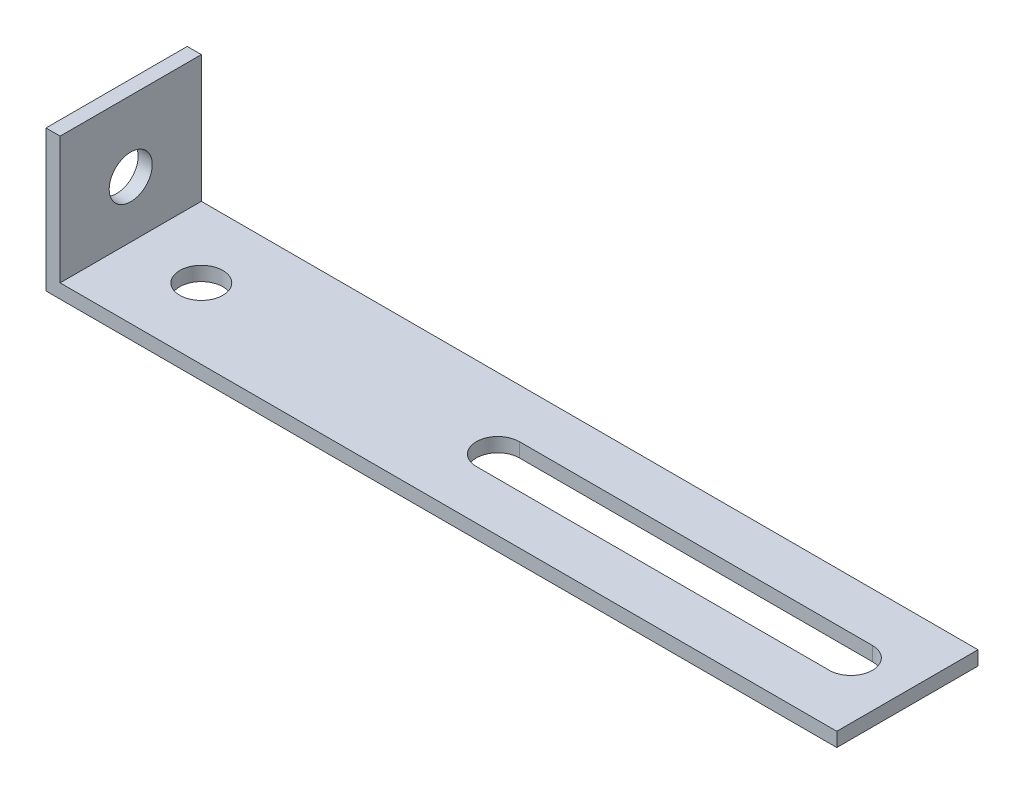
ISO-10303-21;
HEADER;
FILE_DESCRIPTION(('STEP AP214'),'2;1');
FILE_NAME('part.step','',(''),(''),'','','');
FILE_SCHEMA(('AUTOMOTIVE_DESIGN { 1 0 10303 214 1 1 1 1 }'));
ENDSEC;
DATA;
#1=APPLICATION_CONTEXT('core data for automotive mechanical design processes');
#2=APPLICATION_PROTOCOL_DEFINITION('international standard','automotive_design',2000,#1);
#3=PRODUCT_CONTEXT('',#1,'mechanical');
#4=PRODUCT('Part','Part','',(#3));
#5=PRODUCT_RELATED_PRODUCT_CATEGORY('part','',(#4));
#6=PRODUCT_DEFINITION_FORMATION('','',#4);
#7=PRODUCT_DEFINITION_CONTEXT('part definition',#1,'design');
#8=PRODUCT_DEFINITION('design','',#6,#7);
#9=PRODUCT_DEFINITION_SHAPE('','',#8);
#10=(LENGTH_UNIT() NAMED_UNIT(*) SI_UNIT(.MILLI.,.METRE.));
#11=(NAMED_UNIT(*) PLANE_ANGLE_UNIT() SI_UNIT($,.RADIAN.));
#12=(NAMED_UNIT(*) SI_UNIT($,.STERADIAN.) SOLID_ANGLE_UNIT());
#13=UNCERTAINTY_MEASURE_WITH_UNIT(LENGTH_MEASURE(1.E-05),#10,'distance_accuracy_value','');
#14=(GEOMETRIC_REPRESENTATION_CONTEXT(3) GLOBAL_UNCERTAINTY_ASSIGNED_CONTEXT((#13)) GLOBAL_UNIT_ASSIGNED_CONTEXT((#10,
#11,#12)) REPRESENTATION_CONTEXT('',''));
#15=CARTESIAN_POINT('',(0.,0.,0.));
#16=DIRECTION('',(0.,0.,1.));
#17=DIRECTION('',(1.,0.,0.));
#18=AXIS2_PLACEMENT_3D('',#15,#16,#17);
#19=CARTESIAN_POINT('',(112.,0.,20.));
#20=DIRECTION('',(0.,1.,0.));
#21=DIRECTION('',(-1.,0.,0.));
#22=AXIS2_PLACEMENT_3D('',#19,#20,#21);
#23=PLANE('',#22);
#24=DIRECTION('',(-1.,0.,0.));
#25=VECTOR('',#24,1.);
#26=CARTESIAN_POINT('',(54.,0.,6.95));
#27=LINE('',#26,#25);
#28=CARTESIAN_POINT('',(104.,0.,6.95));
#29=VERTEX_POINT('',#28);
#30=CARTESIAN_POINT('',(54.,0.,6.95));
#31=VERTEX_POINT('',#30);
#32=EDGE_CURVE('E123',#29,#31,#27,.T.);
#33=ORIENTED_EDGE('',*,*,#32,.T.);
#34=CARTESIAN_POINT('',(54.,0.,10.));
#35=DIRECTION('',(0.,1.,0.));
#36=DIRECTION('',(-1.,0.,0.));
#37=AXIS2_PLACEMENT_3D('',#34,#35,#36);
#38=CIRCLE('',#37,3.05);
#39=CARTESIAN_POINT('',(54.,0.,13.05));
#40=VERTEX_POINT('',#39);
#41=EDGE_CURVE('E117',#31,#40,#38,.T.);
#42=ORIENTED_EDGE('',*,*,#41,.T.);
#43=DIRECTION('',(1.,0.,0.));
#44=VECTOR('',#43,1.);
#45=CARTESIAN_POINT('',(54.,0.,13.05));
#46=LINE('',#45,#44);
#47=CARTESIAN_POINT('',(104.,0.,13.05));
#48=VERTEX_POINT('',#47);
#49=EDGE_CURVE('E126',#40,#48,#46,.T.);
#50=ORIENTED_EDGE('',*,*,#49,.T.);
#51=CARTESIAN_POINT('',(104.,0.,10.));
#52=DIRECTION('',(0.,1.,0.));
#53=DIRECTION('',(-1.,0.,0.));
#54=AXIS2_PLACEMENT_3D('',#51,#52,#53);
#55=CIRCLE('',#54,3.05);
#56=EDGE_CURVE('E53',#48,#29,#55,.T.);
#57=ORIENTED_EDGE('',*,*,#56,.T.);
#58=EDGE_LOOP('',(#33,#42,#50,#57));
#59=FACE_BOUND('',#58,.T.);
#60=CARTESIAN_POINT('',(12.,0.,10.));
#61=DIRECTION('',(0.,1.,0.));
#62=DIRECTION('',(-1.,0.,0.));
#63=AXIS2_PLACEMENT_3D('',#60,#61,#62);
#64=CIRCLE('',#63,3.05);
#65=CARTESIAN_POINT('',(8.95,0.,10.));
#66=VERTEX_POINT('',#65);
#67=EDGE_CURVE('E151',#66,#66,#64,.T.);
#68=ORIENTED_EDGE('',*,*,#67,.T.);
#69=EDGE_LOOP('',(#68));
#70=FACE_BOUND('',#69,.T.);
#71=DIRECTION('',(1.,0.,0.));
#72=VECTOR('',#71,1.);
#73=CARTESIAN_POINT('',(112.,0.,0.));
#74=LINE('',#73,#72);
#75=CARTESIAN_POINT('',(0.,0.,0.));
#76=VERTEX_POINT('',#75);
#77=CARTESIAN_POINT('',(112.,0.,0.));
#78=VERTEX_POINT('',#77);
#79=EDGE_CURVE('E162',#76,#78,#74,.T.);
#80=ORIENTED_EDGE('',*,*,#79,.T.);
#81=DIRECTION('',(0.,0.,-1.));
#82=VECTOR('',#81,1.);
#83=CARTESIAN_POINT('',(112.,0.,20.));
#84=LINE('',#83,#82);
#85=CARTESIAN_POINT('',(112.,0.,20.));
#86=VERTEX_POINT('',#85);
#87=EDGE_CURVE('E11',#86,#78,#84,.T.);
#88=ORIENTED_EDGE('',*,*,#87,.F.);
#89=DIRECTION('',(1.,0.,0.));
#90=VECTOR('',#89,1.);
#91=CARTESIAN_POINT('',(112.,0.,20.));
#92=LINE('',#91,#90);
#93=CARTESIAN_POINT('',(0.,0.,20.));
#94=VERTEX_POINT('',#93);
#95=EDGE_CURVE('E163',#94,#86,#92,.T.);
#96=ORIENTED_EDGE('',*,*,#95,.F.);
#97=DIRECTION('',(0.,0.,-1.));
#98=VECTOR('',#97,1.);
#99=CARTESIAN_POINT('',(0.,0.,20.));
#100=LINE('',#99,#98);
#101=EDGE_CURVE('E177',#94,#76,#100,.T.);
#102=ORIENTED_EDGE('',*,*,#101,.T.);
#103=EDGE_LOOP('',(#80,#88,#96,#102));
#104=FACE_BOUND('',#103,.T.);
#105=ADVANCED_FACE('F39',(#59,#70,#104),#23,.F.);
#106=CARTESIAN_POINT('',(112.,2.,20.));
#107=DIRECTION('',(-1.,0.,0.));
#108=DIRECTION('',(0.,0.,1.));
#109=AXIS2_PLACEMENT_3D('',#106,#107,#108);
#110=PLANE('',#109);
#111=DIRECTION('',(0.,1.,0.));
#112=VECTOR('',#111,1.);
#113=CARTESIAN_POINT('',(112.,2.,0.));
#114=LINE('',#113,#112);
#115=CARTESIAN_POINT('',(112.,2.,0.));
#116=VERTEX_POINT('',#115);
#117=EDGE_CURVE('E180',#78,#116,#114,.T.);
#118=ORIENTED_EDGE('',*,*,#117,.T.);
#119=DIRECTION('',(0.,0.,-1.));
#120=VECTOR('',#119,1.);
#121=CARTESIAN_POINT('',(112.,2.,20.));
#122=LINE('',#121,#120);
#123=CARTESIAN_POINT('',(112.,2.,20.));
#124=VERTEX_POINT('',#123);
#125=EDGE_CURVE('E46',#124,#116,#122,.T.);
#126=ORIENTED_EDGE('',*,*,#125,.F.);
#127=DIRECTION('',(0.,1.,0.));
#128=VECTOR('',#127,1.);
#129=CARTESIAN_POINT('',(112.,2.,20.));
#130=LINE('',#129,#128);
#131=EDGE_CURVE('E166',#86,#124,#130,.T.);
#132=ORIENTED_EDGE('',*,*,#131,.F.);
#133=ORIENTED_EDGE('',*,*,#87,.T.);
#134=EDGE_LOOP('',(#118,#126,#132,#133));
#135=FACE_BOUND('',#134,.T.);
#136=ADVANCED_FACE('F227',(#135),#110,.F.);
#137=CARTESIAN_POINT('',(2.,2.,20.));
#138=DIRECTION('',(0.,-1.,0.));
#139=DIRECTION('',(1.,0.,0.));
#140=AXIS2_PLACEMENT_3D('',#137,#138,#139);
#141=PLANE('',#140);
#142=DIRECTION('',(1.,0.,0.));
#143=VECTOR('',#142,1.);
#144=CARTESIAN_POINT('',(54.,2.,13.05));
#145=LINE('',#144,#143);
#146=CARTESIAN_POINT('',(54.,2.,13.05));
#147=VERTEX_POINT('',#146);
#148=CARTESIAN_POINT('',(104.,2.,13.05));
#149=VERTEX_POINT('',#148);
#150=EDGE_CURVE('E141',#147,#149,#145,.T.);
#151=ORIENTED_EDGE('',*,*,#150,.F.);
#152=CARTESIAN_POINT('',(54.,2.,10.));
#153=DIRECTION('',(0.,1.,0.));
#154=DIRECTION('',(-1.,0.,0.));
#155=AXIS2_PLACEMENT_3D('',#152,#153,#154);
#156=CIRCLE('',#155,3.05);
#157=CARTESIAN_POINT('',(54.,2.,6.95));
#158=VERTEX_POINT('',#157);
#159=EDGE_CURVE('E61',#158,#147,#156,.T.);
#160=ORIENTED_EDGE('',*,*,#159,.F.);
#161=DIRECTION('',(-1.,0.,0.));
#162=VECTOR('',#161,1.);
#163=CARTESIAN_POINT('',(54.,2.,6.95));
#164=LINE('',#163,#162);
#165=CARTESIAN_POINT('',(104.,2.,6.95));
#166=VERTEX_POINT('',#165);
#167=EDGE_CURVE('E132',#166,#158,#164,.T.);
#168=ORIENTED_EDGE('',*,*,#167,.F.);
#169=CARTESIAN_POINT('',(104.,2.,10.));
#170=DIRECTION('',(0.,1.,0.));
#171=DIRECTION('',(-1.,0.,0.));
#172=AXIS2_PLACEMENT_3D('',#169,#170,#171);
#173=CIRCLE('',#172,3.05);
#174=EDGE_CURVE('E135',#149,#166,#173,.T.);
#175=ORIENTED_EDGE('',*,*,#174,.F.);
#176=EDGE_LOOP('',(#151,#160,#168,#175));
#177=FACE_BOUND('',#176,.T.);
#178=CARTESIAN_POINT('',(12.,2.,10.));
#179=DIRECTION('',(0.,1.,0.));
#180=DIRECTION('',(-1.,0.,0.));
#181=AXIS2_PLACEMENT_3D('',#178,#179,#180);
#182=CIRCLE('',#181,3.05);
#183=CARTESIAN_POINT('',(8.95,2.,10.));
#184=VERTEX_POINT('',#183);
#185=EDGE_CURVE('E147',#184,#184,#182,.T.);
#186=ORIENTED_EDGE('',*,*,#185,.F.);
#187=EDGE_LOOP('',(#186));
#188=FACE_BOUND('',#187,.T.);
#189=DIRECTION('',(-1.,0.,0.));
#190=VECTOR('',#189,1.);
#191=CARTESIAN_POINT('',(2.,2.,0.));
#192=LINE('',#191,#190);
#193=CARTESIAN_POINT('',(2.,2.,0.));
#194=VERTEX_POINT('',#193);
#195=EDGE_CURVE('E182',#116,#194,#192,.T.);
#196=ORIENTED_EDGE('',*,*,#195,.T.);
#197=DIRECTION('',(0.,0.,-1.));
#198=VECTOR('',#197,1.);
#199=CARTESIAN_POINT('',(2.,2.,20.));
#200=LINE('',#199,#198);
#201=CARTESIAN_POINT('',(2.,2.,20.));
#202=VERTEX_POINT('',#201);
#203=EDGE_CURVE('E197',#202,#194,#200,.T.);
#204=ORIENTED_EDGE('',*,*,#203,.F.);
#205=DIRECTION('',(-1.,0.,0.));
#206=VECTOR('',#205,1.);
#207=CARTESIAN_POINT('',(2.,2.,20.));
#208=LINE('',#207,#206);
#209=EDGE_CURVE('E169',#124,#202,#208,.T.);
#210=ORIENTED_EDGE('',*,*,#209,.F.);
#211=ORIENTED_EDGE('',*,*,#125,.T.);
#212=EDGE_LOOP('',(#196,#204,#210,#211));
#213=FACE_BOUND('',#212,.T.);
#214=ADVANCED_FACE('F204',(#177,#188,#213),#141,.F.);
#215=CARTESIAN_POINT('',(2.,20.,20.));
#216=DIRECTION('',(-1.,0.,0.));
#217=DIRECTION('',(0.,-1.,0.));
#218=AXIS2_PLACEMENT_3D('',#215,#216,#217);
#219=PLANE('',#218);
#220=CARTESIAN_POINT('',(2.,10.,10.));
#221=DIRECTION('',(-1.,0.,0.));
#222=DIRECTION('',(0.,-1.,0.));
#223=AXIS2_PLACEMENT_3D('',#220,#221,#222);
#224=CIRCLE('',#223,3.05);
#225=CARTESIAN_POINT('',(2.,6.94999999999999,10.));
#226=VERTEX_POINT('',#225);
#227=EDGE_CURVE('E159',#226,#226,#224,.T.);
#228=ORIENTED_EDGE('',*,*,#227,.T.);
#229=EDGE_LOOP('',(#228));
#230=FACE_BOUND('',#229,.T.);
#231=DIRECTION('',(0.,1.,0.));
#232=VECTOR('',#231,1.);
#233=CARTESIAN_POINT('',(2.,20.,0.));
#234=LINE('',#233,#232);
#235=CARTESIAN_POINT('',(2.,20.,0.));
#236=VERTEX_POINT('',#235);
#237=EDGE_CURVE('E184',#194,#236,#234,.T.);
#238=ORIENTED_EDGE('',*,*,#237,.T.);
#239=DIRECTION('',(0.,0.,-1.));
#240=VECTOR('',#239,1.);
#241=CARTESIAN_POINT('',(2.,20.,20.));
#242=LINE('',#241,#240);
#243=CARTESIAN_POINT('',(2.,20.,20.));
#244=VERTEX_POINT('',#243);
#245=EDGE_CURVE('E194',#244,#236,#242,.T.);
#246=ORIENTED_EDGE('',*,*,#245,.F.);
#247=DIRECTION('',(0.,1.,0.));
#248=VECTOR('',#247,1.);
#249=CARTESIAN_POINT('',(2.,20.,20.));
#250=LINE('',#249,#248);
#251=EDGE_CURVE('E171',#202,#244,#250,.T.);
#252=ORIENTED_EDGE('',*,*,#251,.F.);
#253=ORIENTED_EDGE('',*,*,#203,.T.);
#254=EDGE_LOOP('',(#238,#246,#252,#253));
#255=FACE_BOUND('',#254,.T.);
#256=ADVANCED_FACE('F215',(#230,#255),#219,.F.);
#257=CARTESIAN_POINT('',(0.,20.,20.));
#258=DIRECTION('',(0.,-1.,0.));
#259=DIRECTION('',(0.,0.,-1.));
#260=AXIS2_PLACEMENT_3D('',#257,#258,#259);
#261=PLANE('',#260);
#262=DIRECTION('',(-1.,0.,0.));
#263=VECTOR('',#262,1.);
#264=CARTESIAN_POINT('',(0.,20.,0.));
#265=LINE('',#264,#263);
#266=CARTESIAN_POINT('',(0.,20.,0.));
#267=VERTEX_POINT('',#266);
#268=EDGE_CURVE('E186',#236,#267,#265,.T.);
#269=ORIENTED_EDGE('',*,*,#268,.T.);
#270=DIRECTION('',(0.,0.,-1.));
#271=VECTOR('',#270,1.);
#272=CARTESIAN_POINT('',(0.,20.,20.));
#273=LINE('',#272,#271);
#274=CARTESIAN_POINT('',(0.,20.,20.));
#275=VERTEX_POINT('',#274);
#276=EDGE_CURVE('E191',#275,#267,#273,.T.);
#277=ORIENTED_EDGE('',*,*,#276,.F.);
#278=DIRECTION('',(-1.,0.,0.));
#279=VECTOR('',#278,1.);
#280=CARTESIAN_POINT('',(0.,20.,20.));
#281=LINE('',#280,#279);
#282=EDGE_CURVE('E173',#244,#275,#281,.T.);
#283=ORIENTED_EDGE('',*,*,#282,.F.);
#284=ORIENTED_EDGE('',*,*,#245,.T.);
#285=EDGE_LOOP('',(#269,#277,#283,#284));
#286=FACE_BOUND('',#285,.T.);
#287=ADVANCED_FACE('F219',(#286),#261,.F.);
#288=CARTESIAN_POINT('',(0.,0.,20.));
#289=DIRECTION('',(1.,0.,0.));
#290=DIRECTION('',(0.,0.,-1.));
#291=AXIS2_PLACEMENT_3D('',#288,#289,#290);
#292=PLANE('',#291);
#293=CARTESIAN_POINT('',(0.,10.,10.));
#294=DIRECTION('',(-1.,0.,0.));
#295=DIRECTION('',(0.,0.,1.));
#296=AXIS2_PLACEMENT_3D('',#293,#294,#295);
#297=CIRCLE('',#296,3.05);
#298=CARTESIAN_POINT('',(0.,10.,13.05));
#299=VERTEX_POINT('',#298);
#300=EDGE_CURVE('E154',#299,#299,#297,.T.);
#301=ORIENTED_EDGE('',*,*,#300,.F.);
#302=EDGE_LOOP('',(#301));
#303=FACE_BOUND('',#302,.T.);
#304=DIRECTION('',(0.,-1.,0.));
#305=VECTOR('',#304,1.);
#306=CARTESIAN_POINT('',(0.,0.,0.));
#307=LINE('',#306,#305);
#308=EDGE_CURVE('E167',#267,#76,#307,.T.);
#309=ORIENTED_EDGE('',*,*,#308,.T.);
#310=ORIENTED_EDGE('',*,*,#101,.F.);
#311=DIRECTION('',(0.,-1.,0.));
#312=VECTOR('',#311,1.);
#313=CARTESIAN_POINT('',(0.,0.,20.));
#314=LINE('',#313,#312);
#315=EDGE_CURVE('E175',#275,#94,#314,.T.);
#316=ORIENTED_EDGE('',*,*,#315,.F.);
#317=ORIENTED_EDGE('',*,*,#276,.T.);
#318=EDGE_LOOP('',(#309,#310,#316,#317));
#319=FACE_BOUND('',#318,.T.);
#320=ADVANCED_FACE('F230',(#303,#319),#292,.F.);
#321=CARTESIAN_POINT('',(0.,0.,20.));
#322=DIRECTION('',(0.,0.,-1.));
#323=DIRECTION('',(-1.,0.,0.));
#324=AXIS2_PLACEMENT_3D('',#321,#322,#323);
#325=PLANE('',#324);
#326=ORIENTED_EDGE('',*,*,#95,.T.);
#327=ORIENTED_EDGE('',*,*,#131,.T.);
#328=ORIENTED_EDGE('',*,*,#209,.T.);
#329=ORIENTED_EDGE('',*,*,#251,.T.);
#330=ORIENTED_EDGE('',*,*,#282,.T.);
#331=ORIENTED_EDGE('',*,*,#315,.T.);
#332=EDGE_LOOP('',(#326,#327,#328,#329,#330,#331));
#333=FACE_BOUND('',#332,.T.);
#334=ADVANCED_FACE('F223',(#333),#325,.F.);
#335=CARTESIAN_POINT('',(0.,0.,0.));
#336=DIRECTION('',(0.,0.,-1.));
#337=DIRECTION('',(-1.,0.,0.));
#338=AXIS2_PLACEMENT_3D('',#335,#336,#337);
#339=PLANE('',#338);
#340=ORIENTED_EDGE('',*,*,#79,.F.);
#341=ORIENTED_EDGE('',*,*,#308,.F.);
#342=ORIENTED_EDGE('',*,*,#268,.F.);
#343=ORIENTED_EDGE('',*,*,#237,.F.);
#344=ORIENTED_EDGE('',*,*,#195,.F.);
#345=ORIENTED_EDGE('',*,*,#117,.F.);
#346=EDGE_LOOP('',(#340,#341,#342,#343,#344,#345));
#347=FACE_BOUND('',#346,.T.);
#348=ADVANCED_FACE('F210',(#347),#339,.T.);
#349=CARTESIAN_POINT('',(112.,10.,10.));
#350=DIRECTION('',(-1.,0.,0.));
#351=DIRECTION('',(0.,0.,1.));
#352=AXIS2_PLACEMENT_3D('',#349,#350,#351);
#353=CYLINDRICAL_SURFACE('',#352,3.05);
#354=ORIENTED_EDGE('',*,*,#300,.T.);
#355=EDGE_LOOP('',(#354));
#356=FACE_BOUND('',#355,.T.);
#357=ORIENTED_EDGE('',*,*,#227,.F.);
#358=EDGE_LOOP('',(#357));
#359=FACE_BOUND('',#358,.T.);
#360=ADVANCED_FACE('F258',(#356,#359),#353,.F.);
#361=CARTESIAN_POINT('',(12.,0.,10.));
#362=DIRECTION('',(0.,1.,0.));
#363=DIRECTION('',(-1.,0.,0.));
#364=AXIS2_PLACEMENT_3D('',#361,#362,#363);
#365=CYLINDRICAL_SURFACE('',#364,3.05);
#366=ORIENTED_EDGE('',*,*,#67,.F.);
#367=EDGE_LOOP('',(#366));
#368=FACE_BOUND('',#367,.T.);
#369=ORIENTED_EDGE('',*,*,#185,.T.);
#370=EDGE_LOOP('',(#369));
#371=FACE_BOUND('',#370,.T.);
#372=ADVANCED_FACE('F260',(#368,#371),#365,.F.);
#373=CARTESIAN_POINT('',(54.,0.,10.));
#374=DIRECTION('',(0.,1.,0.));
#375=DIRECTION('',(-1.,0.,0.));
#376=AXIS2_PLACEMENT_3D('',#373,#374,#375);
#377=CYLINDRICAL_SURFACE('',#376,3.05);
#378=ORIENTED_EDGE('',*,*,#159,.T.);
#379=DIRECTION('',(0.,1.,0.));
#380=VECTOR('',#379,1.);
#381=CARTESIAN_POINT('',(54.,0.,13.05));
#382=LINE('',#381,#380);
#383=EDGE_CURVE('E113',#40,#147,#382,.T.);
#384=ORIENTED_EDGE('',*,*,#383,.F.);
#385=ORIENTED_EDGE('',*,*,#41,.F.);
#386=DIRECTION('',(0.,1.,0.));
#387=VECTOR('',#386,1.);
#388=CARTESIAN_POINT('',(54.,0.,6.95));
#389=LINE('',#388,#387);
#390=EDGE_CURVE('E145',#31,#158,#389,.T.);
#391=ORIENTED_EDGE('',*,*,#390,.T.);
#392=EDGE_LOOP('',(#378,#384,#385,#391));
#393=FACE_BOUND('',#392,.T.);
#394=ADVANCED_FACE('F115',(#393),#377,.F.);
#395=CARTESIAN_POINT('',(54.,0.,6.95));
#396=DIRECTION('',(0.,0.,-1.));
#397=DIRECTION('',(-1.,0.,0.));
#398=AXIS2_PLACEMENT_3D('',#395,#396,#397);
#399=PLANE('',#398);
#400=ORIENTED_EDGE('',*,*,#167,.T.);
#401=ORIENTED_EDGE('',*,*,#390,.F.);
#402=ORIENTED_EDGE('',*,*,#32,.F.);
#403=DIRECTION('',(0.,1.,0.));
#404=VECTOR('',#403,1.);
#405=CARTESIAN_POINT('',(104.,0.,6.95));
#406=LINE('',#405,#404);
#407=EDGE_CURVE('E148',#29,#166,#406,.T.);
#408=ORIENTED_EDGE('',*,*,#407,.T.);
#409=EDGE_LOOP('',(#400,#401,#402,#408));
#410=FACE_BOUND('',#409,.T.);
#411=ADVANCED_FACE('F272',(#410),#399,.F.);
#412=CARTESIAN_POINT('',(104.,0.,10.));
#413=DIRECTION('',(0.,1.,0.));
#414=DIRECTION('',(-1.,0.,0.));
#415=AXIS2_PLACEMENT_3D('',#412,#413,#414);
#416=CYLINDRICAL_SURFACE('',#415,3.05);
#417=ORIENTED_EDGE('',*,*,#174,.T.);
#418=ORIENTED_EDGE('',*,*,#407,.F.);
#419=ORIENTED_EDGE('',*,*,#56,.F.);
#420=DIRECTION('',(0.,1.,0.));
#421=VECTOR('',#420,1.);
#422=CARTESIAN_POINT('',(104.,0.,13.05));
#423=LINE('',#422,#421);
#424=EDGE_CURVE('E122',#48,#149,#423,.T.);
#425=ORIENTED_EDGE('',*,*,#424,.T.);
#426=EDGE_LOOP('',(#417,#418,#419,#425));
#427=FACE_BOUND('',#426,.T.);
#428=ADVANCED_FACE('F275',(#427),#416,.F.);
#429=CARTESIAN_POINT('',(54.,0.,13.05));
#430=DIRECTION('',(0.,0.,1.));
#431=DIRECTION('',(1.,0.,0.));
#432=AXIS2_PLACEMENT_3D('',#429,#430,#431);
#433=PLANE('',#432);
#434=ORIENTED_EDGE('',*,*,#150,.T.);
#435=ORIENTED_EDGE('',*,*,#424,.F.);
#436=ORIENTED_EDGE('',*,*,#49,.F.);
#437=ORIENTED_EDGE('',*,*,#383,.T.);
#438=EDGE_LOOP('',(#434,#435,#436,#437));
#439=FACE_BOUND('',#438,.T.);
#440=ADVANCED_FACE('F127',(#439),#433,.F.);
#441=CLOSED_SHELL('',(#105,#136,#214,#256,#287,#320,#334,#348,#360,#372,#394,#411,#428,#440));
#442=MANIFOLD_SOLID_BREP('B2',#441);
#443=ADVANCED_BREP_SHAPE_REPRESENTATION('',(#18,#442),#14);
#444=SHAPE_DEFINITION_REPRESENTATION(#9,#443);
ENDSEC;
END-ISO-10303-21;
